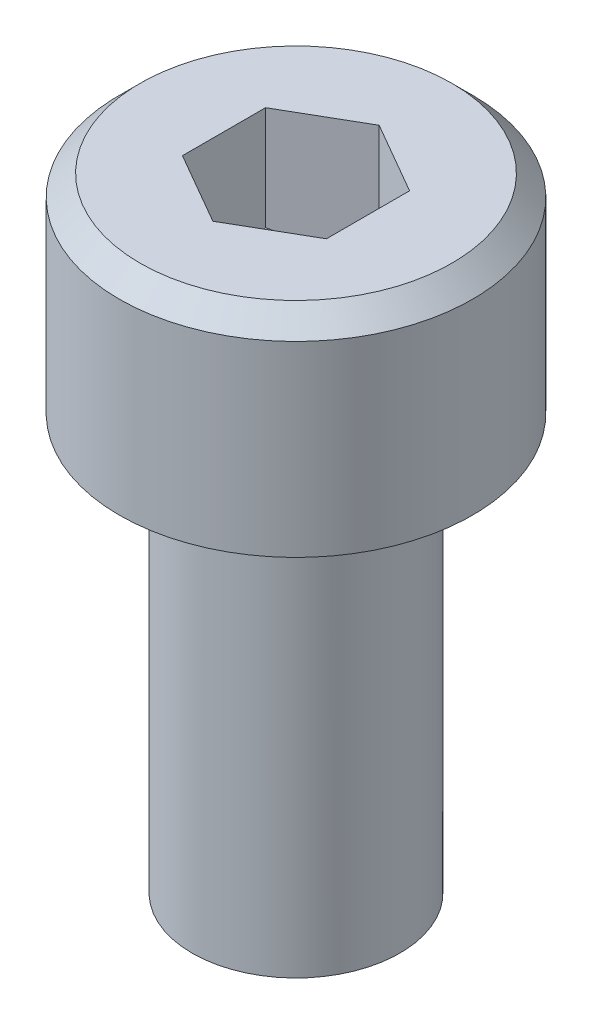
ISO-10303-21;
HEADER;
FILE_DESCRIPTION(('STEP AP214'),'2;1');
FILE_NAME('part.step','',(''),(''),'','','');
FILE_SCHEMA(('AUTOMOTIVE_DESIGN { 1 0 10303 214 1 1 1 1 }'));
ENDSEC;
DATA;
#1=APPLICATION_CONTEXT('core data for automotive mechanical design processes');
#2=APPLICATION_PROTOCOL_DEFINITION('international standard','automotive_design',2000,#1);
#3=PRODUCT_CONTEXT('',#1,'mechanical');
#4=PRODUCT('Part','Part','',(#3));
#5=PRODUCT_RELATED_PRODUCT_CATEGORY('part','',(#4));
#6=PRODUCT_DEFINITION_FORMATION('','',#4);
#7=PRODUCT_DEFINITION_CONTEXT('part definition',#1,'design');
#8=PRODUCT_DEFINITION('design','',#6,#7);
#9=PRODUCT_DEFINITION_SHAPE('','',#8);
#10=(LENGTH_UNIT() NAMED_UNIT(*) SI_UNIT(.MILLI.,.METRE.));
#11=(NAMED_UNIT(*) PLANE_ANGLE_UNIT() SI_UNIT($,.RADIAN.));
#12=(NAMED_UNIT(*) SI_UNIT($,.STERADIAN.) SOLID_ANGLE_UNIT());
#13=UNCERTAINTY_MEASURE_WITH_UNIT(LENGTH_MEASURE(1.E-05),#10,'distance_accuracy_value','');
#14=(GEOMETRIC_REPRESENTATION_CONTEXT(3) GLOBAL_UNCERTAINTY_ASSIGNED_CONTEXT((#13)) GLOBAL_UNIT_ASSIGNED_CONTEXT((#10,
#11,#12)) REPRESENTATION_CONTEXT('',''));
#15=CARTESIAN_POINT('',(0.,0.,0.));
#16=DIRECTION('',(0.,0.,1.));
#17=DIRECTION('',(1.,0.,0.));
#18=AXIS2_PLACEMENT_3D('',#15,#16,#17);
#19=CARTESIAN_POINT('',(0.,0.,0.));
#20=DIRECTION('',(0.,1.,0.));
#21=DIRECTION('',(0.,0.,1.));
#22=AXIS2_PLACEMENT_3D('',#19,#20,#21);
#23=PLANE('',#22);
#24=CARTESIAN_POINT('',(0.,0.,0.));
#25=DIRECTION('',(0.,1.,0.));
#26=DIRECTION('',(0.,0.,1.));
#27=AXIS2_PLACEMENT_3D('',#24,#25,#26);
#28=CIRCLE('',#27,4.25);
#29=CARTESIAN_POINT('',(0.,0.,4.25));
#30=VERTEX_POINT('',#29);
#31=EDGE_CURVE('E192',#30,#30,#28,.T.);
#32=ORIENTED_EDGE('',*,*,#31,.F.);
#33=EDGE_LOOP('',(#32));
#34=FACE_BOUND('',#33,.T.);
#35=CARTESIAN_POINT('',(0.,0.,0.));
#36=DIRECTION('',(0.,1.,0.));
#37=DIRECTION('',(0.,0.,1.));
#38=AXIS2_PLACEMENT_3D('',#35,#36,#37);
#39=CIRCLE('',#38,2.5);
#40=CARTESIAN_POINT('',(0.,0.,2.5));
#41=VERTEX_POINT('',#40);
#42=EDGE_CURVE('E11',#41,#41,#39,.F.);
#43=ORIENTED_EDGE('',*,*,#42,.F.);
#44=EDGE_LOOP('',(#43));
#45=FACE_BOUND('',#44,.T.);
#46=ADVANCED_FACE('F32',(#34,#45),#23,.F.);
#47=CARTESIAN_POINT('',(0.,5.,0.));
#48=DIRECTION('',(0.,1.,0.));
#49=DIRECTION('',(0.,0.,1.));
#50=AXIS2_PLACEMENT_3D('',#47,#48,#49);
#51=PLANE('',#50);
#52=CARTESIAN_POINT('',(0.,5.,0.));
#53=DIRECTION('',(0.,1.,0.));
#54=DIRECTION('',(0.,0.,1.));
#55=AXIS2_PLACEMENT_3D('',#52,#53,#54);
#56=CIRCLE('',#55,3.75);
#57=CARTESIAN_POINT('',(0.,5.,3.75));
#58=VERTEX_POINT('',#57);
#59=EDGE_CURVE('E105',#58,#58,#56,.T.);
#60=ORIENTED_EDGE('',*,*,#59,.T.);
#61=EDGE_LOOP('',(#60));
#62=FACE_BOUND('',#61,.T.);
#63=DIRECTION('',(-0.866025403784439,0.,0.5));
#64=VECTOR('',#63,1.);
#65=CARTESIAN_POINT('',(0.,5.,-2.));
#66=LINE('',#65,#64);
#67=CARTESIAN_POINT('',(0.,5.,-2.));
#68=VERTEX_POINT('',#67);
#69=CARTESIAN_POINT('',(-1.73205080756888,5.,-1.));
#70=VERTEX_POINT('',#69);
#71=EDGE_CURVE('E168',#68,#70,#66,.T.);
#72=ORIENTED_EDGE('',*,*,#71,.F.);
#73=DIRECTION('',(-0.866025403784439,0.,-0.5));
#74=VECTOR('',#73,1.);
#75=CARTESIAN_POINT('',(1.73205080756888,5.,-1.));
#76=LINE('',#75,#74);
#77=CARTESIAN_POINT('',(1.73205080756888,5.,-1.));
#78=VERTEX_POINT('',#77);
#79=EDGE_CURVE('E166',#78,#68,#76,.T.);
#80=ORIENTED_EDGE('',*,*,#79,.F.);
#81=DIRECTION('',(0.,0.,-1.));
#82=VECTOR('',#81,1.);
#83=CARTESIAN_POINT('',(1.73205080756888,5.,1.));
#84=LINE('',#83,#82);
#85=CARTESIAN_POINT('',(1.73205080756888,5.,1.));
#86=VERTEX_POINT('',#85);
#87=EDGE_CURVE('E177',#86,#78,#84,.T.);
#88=ORIENTED_EDGE('',*,*,#87,.F.);
#89=DIRECTION('',(0.866025403784439,0.,-0.5));
#90=VECTOR('',#89,1.);
#91=CARTESIAN_POINT('',(0.,5.,2.));
#92=LINE('',#91,#90);
#93=CARTESIAN_POINT('',(0.,5.,2.));
#94=VERTEX_POINT('',#93);
#95=EDGE_CURVE('E174',#94,#86,#92,.T.);
#96=ORIENTED_EDGE('',*,*,#95,.F.);
#97=DIRECTION('',(0.866025403784439,0.,0.5));
#98=VECTOR('',#97,1.);
#99=CARTESIAN_POINT('',(-1.73205080756888,5.,1.));
#100=LINE('',#99,#98);
#101=CARTESIAN_POINT('',(-1.73205080756888,5.,1.));
#102=VERTEX_POINT('',#101);
#103=EDGE_CURVE('E172',#102,#94,#100,.T.);
#104=ORIENTED_EDGE('',*,*,#103,.F.);
#105=DIRECTION('',(0.,0.,1.));
#106=VECTOR('',#105,1.);
#107=CARTESIAN_POINT('',(-1.73205080756888,5.,-1.));
#108=LINE('',#107,#106);
#109=EDGE_CURVE('E170',#70,#102,#108,.T.);
#110=ORIENTED_EDGE('',*,*,#109,.F.);
#111=EDGE_LOOP('',(#72,#80,#88,#96,#104,#110));
#112=FACE_BOUND('',#111,.T.);
#113=ADVANCED_FACE('F160',(#62,#112),#51,.T.);
#114=CARTESIAN_POINT('',(0.,5.,0.));
#115=DIRECTION('',(0.,-1.,0.));
#116=DIRECTION('',(0.,0.,-1.));
#117=AXIS2_PLACEMENT_3D('',#114,#115,#116);
#118=CYLINDRICAL_SURFACE('',#117,4.25);
#119=CARTESIAN_POINT('',(0.,4.5,0.));
#120=DIRECTION('',(0.,1.,0.));
#121=DIRECTION('',(0.,0.,1.));
#122=AXIS2_PLACEMENT_3D('',#119,#120,#121);
#123=CIRCLE('',#122,4.25);
#124=CARTESIAN_POINT('',(0.,4.5,4.25));
#125=VERTEX_POINT('',#124);
#126=EDGE_CURVE('E103',#125,#125,#123,.F.);
#127=ORIENTED_EDGE('',*,*,#126,.T.);
#128=EDGE_LOOP('',(#127));
#129=FACE_BOUND('',#128,.T.);
#130=ORIENTED_EDGE('',*,*,#31,.T.);
#131=EDGE_LOOP('',(#130));
#132=FACE_BOUND('',#131,.T.);
#133=ADVANCED_FACE('F158',(#129,#132),#118,.T.);
#134=CARTESIAN_POINT('',(1.73205080756888,5.,-1.));
#135=DIRECTION('',(-0.5,0.,0.866025403784439));
#136=DIRECTION('',(0.866025403784439,0.,0.5));
#137=AXIS2_PLACEMENT_3D('',#134,#135,#136);
#138=PLANE('',#137);
#139=CARTESIAN_POINT('',(1.73225080756888,2.50006667243984,-0.999884529946163));
#140=CARTESIAN_POINT('',(1.65613428887404,2.4746827944393,-1.04383042250441));
#141=CARTESIAN_POINT('',(1.57936074093407,2.4515966496139,-1.08815565107419));
#142=CARTESIAN_POINT('',(1.42448408732132,2.41129855775073,-1.1775737287287));
#143=CARTESIAN_POINT('',(1.34637822864777,2.39410086841456,-1.22266816725916));
#144=CARTESIAN_POINT('',(1.19113453943101,2.36732879891765,-1.31229815301844));
#145=CARTESIAN_POINT('',(1.11402060217238,2.35757625955007,-1.35681990545299));
#146=CARTESIAN_POINT('',(0.959429673697303,2.34593140028623,-1.44607301962235));
#147=CARTESIAN_POINT('',(0.881953244796008,2.34402943993446,-1.49080405670436));
#148=CARTESIAN_POINT('',(0.737170488028564,2.34797525273925,-1.57439442029806));
#149=CARTESIAN_POINT('',(0.669842543569503,2.3528541917126,-1.61326622715548));
#150=CARTESIAN_POINT('',(0.535625319068816,2.36832095959228,-1.69075657785084));
#151=CARTESIAN_POINT('',(0.468736503645497,2.37891407765609,-1.72937485344127));
#152=CARTESIAN_POINT('',(0.334242298486415,2.40539738895299,-1.80702511899431));
#153=CARTESIAN_POINT('',(0.266653940840587,2.42139990201939,-1.84604727547521));
#154=CARTESIAN_POINT('',(0.132485590661142,2.45771982631927,-1.92350940856804));
#155=CARTESIAN_POINT('',(0.0659038777399556,2.47802869743662,-1.9619503784462));
#156=CARTESIAN_POINT('',(-0.000200000000000149,2.50006667243984,-2.00011547005384));
#157=B_SPLINE_CURVE_WITH_KNOTS('',3,(#139,#140,#141,#142,#143,#144,#145,#146,#147,#148,#149,
#150,#151,#152,#153,#154,#155,#156),.UNSPECIFIED.,.F.,.F.,(4,2,2,2,2,2,2,2,4),(0.,
0.27455973272559,0.54977963137929,0.818187148094555,1.08626496403989,1.31973233850631,
1.55341618675482,1.79228517679322,2.03068481371441),.UNSPECIFIED.);
#158=CARTESIAN_POINT('',(1.73205080756888,2.5,-1.));
#159=VERTEX_POINT('',#158);
#160=CARTESIAN_POINT('',(0.,2.5,-2.));
#161=VERTEX_POINT('',#160);
#162=EDGE_CURVE('E98',#159,#161,#157,.T.);
#163=ORIENTED_EDGE('',*,*,#162,.F.);
#164=DIRECTION('',(0.,-1.,0.));
#165=VECTOR('',#164,1.);
#166=CARTESIAN_POINT('',(1.73205080756888,5.,-1.));
#167=LINE('',#166,#165);
#168=EDGE_CURVE('E179',#78,#159,#167,.T.);
#169=ORIENTED_EDGE('',*,*,#168,.F.);
#170=ORIENTED_EDGE('',*,*,#79,.T.);
#171=DIRECTION('',(0.,-1.,0.));
#172=VECTOR('',#171,1.);
#173=CARTESIAN_POINT('',(0.,5.,-2.));
#174=LINE('',#173,#172);
#175=EDGE_CURVE('E190',#68,#161,#174,.T.);
#176=ORIENTED_EDGE('',*,*,#175,.T.);
#177=EDGE_LOOP('',(#163,#169,#170,#176));
#178=FACE_BOUND('',#177,.T.);
#179=ADVANCED_FACE('F154',(#178),#138,.T.);
#180=CARTESIAN_POINT('',(0.,5.,-2.));
#181=DIRECTION('',(0.5,0.,0.866025403784439));
#182=DIRECTION('',(0.866025403784439,0.,-0.5));
#183=AXIS2_PLACEMENT_3D('',#180,#181,#182);
#184=PLANE('',#183);
#185=CARTESIAN_POINT('',(0.000199999999999798,2.50006667243984,-2.00011547005384));
#186=CARTESIAN_POINT('',(-0.0759165186948397,2.4746827944393,-1.9561695774956));
#187=CARTESIAN_POINT('',(-0.152690066634804,2.4515966496139,-1.91184434892581));
#188=CARTESIAN_POINT('',(-0.307566720247552,2.41129855775073,-1.82242627127131));
#189=CARTESIAN_POINT('',(-0.385672578921111,2.39410086841456,-1.77733183274084));
#190=CARTESIAN_POINT('',(-0.540916268137865,2.36732879891765,-1.68770184698156));
#191=CARTESIAN_POINT('',(-0.618030205396501,2.35757625955007,-1.64318009454701));
#192=CARTESIAN_POINT('',(-0.772621133871575,2.34593140028623,-1.55392698037765));
#193=CARTESIAN_POINT('',(-0.850097562772869,2.34402943993446,-1.50919594329564));
#194=CARTESIAN_POINT('',(-0.994880319540313,2.34797525273925,-1.42560557970194));
#195=CARTESIAN_POINT('',(-1.06220826399937,2.3528541917126,-1.38673377284452));
#196=CARTESIAN_POINT('',(-1.19642548850006,2.36832095959228,-1.30924342214916));
#197=CARTESIAN_POINT('',(-1.26331430392338,2.37891407765609,-1.27062514655873));
#198=CARTESIAN_POINT('',(-1.39780850908246,2.40539738895299,-1.19297488100569));
#199=CARTESIAN_POINT('',(-1.46539686672829,2.42139990201939,-1.15395272452479));
#200=CARTESIAN_POINT('',(-1.59956521690774,2.45771982631927,-1.07649059143196));
#201=CARTESIAN_POINT('',(-1.66614692982892,2.47802869743662,-1.0380496215538));
#202=CARTESIAN_POINT('',(-1.73225080756888,2.50006667243984,-0.999884529946163));
#203=B_SPLINE_CURVE_WITH_KNOTS('',3,(#185,#186,#187,#188,#189,#190,#191,#192,#193,#194,#195,
#196,#197,#198,#199,#200,#201,#202),.UNSPECIFIED.,.F.,.F.,(4,2,2,2,2,2,2,2,4),(0.,
0.274559732725589,0.54977963137929,0.818187148094556,1.08626496403989,1.31973233850631,
1.55341618675482,1.79228517679322,2.03068481371441),.UNSPECIFIED.);
#204=CARTESIAN_POINT('',(-1.73205080756888,2.5,-1.));
#205=VERTEX_POINT('',#204);
#206=EDGE_CURVE('E47',#161,#205,#203,.T.);
#207=ORIENTED_EDGE('',*,*,#206,.F.);
#208=ORIENTED_EDGE('',*,*,#175,.F.);
#209=ORIENTED_EDGE('',*,*,#71,.T.);
#210=DIRECTION('',(0.,-1.,0.));
#211=VECTOR('',#210,1.);
#212=CARTESIAN_POINT('',(-1.73205080756888,5.,-1.));
#213=LINE('',#212,#211);
#214=EDGE_CURVE('E188',#70,#205,#213,.T.);
#215=ORIENTED_EDGE('',*,*,#214,.T.);
#216=EDGE_LOOP('',(#207,#208,#209,#215));
#217=FACE_BOUND('',#216,.T.);
#218=ADVANCED_FACE('F150',(#217),#184,.T.);
#219=CARTESIAN_POINT('',(-1.73205080756888,5.,-1.));
#220=DIRECTION('',(1.,0.,0.));
#221=DIRECTION('',(0.,0.,-1.));
#222=AXIS2_PLACEMENT_3D('',#219,#220,#221);
#223=PLANE('',#222);
#224=CARTESIAN_POINT('',(-1.73205080756888,3.1440376125908,-2.5896673159434));
#225=CARTESIAN_POINT('',(-1.73205080756888,3.1081532993572,-2.51487129441258));
#226=CARTESIAN_POINT('',(-1.73205080756888,3.07264180094342,-2.43989321341111));
#227=CARTESIAN_POINT('',(-1.73205080756888,3.00257568839842,-2.28947551049629));
#228=CARTESIAN_POINT('',(-1.73205080756888,2.96802124647377,-2.21403580846524));
#229=CARTESIAN_POINT('',(-1.73205080756888,2.89988746183312,-2.06216489115277));
#230=CARTESIAN_POINT('',(-1.73205080756888,2.86631530559594,-1.98573043725538));
#231=CARTESIAN_POINT('',(-1.73205080756888,2.80067719106254,-1.83222138430322));
#232=CARTESIAN_POINT('',(-1.73205080756888,2.76861115445054,-1.75514681877901));
#233=CARTESIAN_POINT('',(-1.73205080756888,2.70556618325513,-1.59819907537578));
#234=CARTESIAN_POINT('',(-1.73205080756888,2.67463757869329,-1.51830540788734));
#235=CARTESIAN_POINT('',(-1.73205080756888,2.61536217373233,-1.35756906964271));
#236=CARTESIAN_POINT('',(-1.73205080756888,2.58701569685053,-1.27672628139876));
#237=CARTESIAN_POINT('',(-1.73205080756888,2.50704492676769,-1.03290576350719));
#238=CARTESIAN_POINT('',(-1.73205080756888,2.46030169353859,-0.868189689498154));
#239=CARTESIAN_POINT('',(-1.73205080756888,2.40608184073772,-0.617819867786136));
#240=CARTESIAN_POINT('',(-1.73205080756888,2.39066472317627,-0.533893853699956));
#241=CARTESIAN_POINT('',(-1.73205080756888,2.36618570680831,-0.365097731528907));
#242=CARTESIAN_POINT('',(-1.73205080756888,2.3571233785332,-0.280227687637224));
#243=CARTESIAN_POINT('',(-1.73205080756888,2.34619219923897,-0.111034775162018));
#244=CARTESIAN_POINT('',(-1.73205080756888,2.34423846009099,-0.0267175343234751));
#245=CARTESIAN_POINT('',(-1.73205080756888,2.34746339548105,0.141777688116827));
#246=CARTESIAN_POINT('',(-1.73205080756888,2.35264251165942,0.225955660772505));
#247=CARTESIAN_POINT('',(-1.73205080756888,2.37376540485988,0.433652313400891));
#248=CARTESIAN_POINT('',(-1.73205080756888,2.39366766704096,0.556768504070765));
#249=CARTESIAN_POINT('',(-1.73205080756888,2.44498985869219,0.800606744349552));
#250=CARTESIAN_POINT('',(-1.73205080756888,2.47642366971486,0.92132572282165));
#251=CARTESIAN_POINT('',(-1.73205080756888,2.53012030029334,1.10187422867007));
#252=CARTESIAN_POINT('',(-1.73205080756888,2.54936060168207,1.16263703303128));
#253=CARTESIAN_POINT('',(-1.73205080756888,2.58962104251422,1.28353014044251));
#254=CARTESIAN_POINT('',(-1.73205080756888,2.61064007120124,1.34366081224314));
#255=CARTESIAN_POINT('',(-1.73205080756888,2.65415270851257,1.46337001063291));
#256=CARTESIAN_POINT('',(-1.73205080756888,2.67664604915465,1.52294863533161));
#257=CARTESIAN_POINT('',(-1.73205080756888,2.72286400880403,1.64163642546934));
#258=CARTESIAN_POINT('',(-1.73205080756888,2.74658883584065,1.70074550963375));
#259=CARTESIAN_POINT('',(-1.73205080756888,2.80866719587004,1.85162387606727));
#260=CARTESIAN_POINT('',(-1.73205080756888,2.84775318254703,1.94309147041311));
#261=CARTESIAN_POINT('',(-1.73205080756888,2.92780932652803,2.12520067435816));
#262=CARTESIAN_POINT('',(-1.73205080756888,2.96877962498281,2.21584222146815));
#263=CARTESIAN_POINT('',(-1.73205080756888,3.09385274691322,2.48680302855764));
#264=CARTESIAN_POINT('',(-1.73205080756888,3.18010497450379,2.66612818791705));
#265=CARTESIAN_POINT('',(-1.73205080756888,3.35622683330508,3.02324647302675));
#266=CARTESIAN_POINT('',(-1.73205080756888,3.44610078118306,3.20103744437731));
#267=CARTESIAN_POINT('',(-1.73205080756888,3.62815962598208,3.5554012639214));
#268=CARTESIAN_POINT('',(-1.73205080756888,3.72034422915963,3.73197426334749));
#269=CARTESIAN_POINT('',(-1.73205080756888,3.89752920335285,4.06765088834573));
#270=CARTESIAN_POINT('',(-1.73205080756888,3.98238641949491,4.22683034049175));
#271=CARTESIAN_POINT('',(-1.73205080756888,4.15306771260156,4.54467721159046));
#272=CARTESIAN_POINT('',(-1.73205080756888,4.23889182534709,4.70334461131279));
#273=CARTESIAN_POINT('',(-1.73205080756888,4.41104522302679,5.01988184110242));
#274=CARTESIAN_POINT('',(-1.73205080756888,4.49737266780107,5.17775267330624));
#275=CARTESIAN_POINT('',(-1.73205080756888,4.67058942356533,5.49317516088085));
#276=CARTESIAN_POINT('',(-1.73205080756888,4.75747870491512,5.65072683252255));
#277=CARTESIAN_POINT('',(-1.73205080756888,4.8445740129932,5.80816383701844));
#278=B_SPLINE_CURVE_WITH_KNOTS('',3,(#224,#225,#226,#227,#228,#229,#230,#231,#232,#233,#234,
#235,#236,#237,#238,#239,#240,#241,#242,#243,#244,#245,#246,#247,#248,#249,#250,#251,#252,#253,
#254,#255,#256,#257,#258,#259,#260,#261,#262,#263,#264,#265,#266,#267,#268,#269,#270,#271,#272,
#273,#274,#275,#276,#277),.UNSPECIFIED.,.F.,.F.,(4,2,2,2,2,2,2,2,2,2,2,2,2,2,2,2,2,2,2,2,2,2,2,
2,2,2,4),(0.,0.248878971051947,0.497802436625335,0.748235880772791,0.998656288339561,
1.25562290868844,1.51262168048206,2.02516943334833,2.28096617636514,2.53674563049094,
2.78946044710838,3.04219091160701,3.41556675213835,3.78939354126393,3.98058119009729,
4.17165031733908,4.36268481019155,4.55375167931396,4.85212720532223,5.15052511868171,
5.74741950373562,6.34504767480783,6.94260025353071,7.48375227728851,8.02492439311034,
8.56472002352741,9.10448740518546),.UNSPECIFIED.);
#279=CARTESIAN_POINT('',(-1.73205080756888,2.5,1.));
#280=VERTEX_POINT('',#279);
#281=EDGE_CURVE('E55',#205,#280,#278,.T.);
#282=ORIENTED_EDGE('',*,*,#281,.F.);
#283=ORIENTED_EDGE('',*,*,#214,.F.);
#284=ORIENTED_EDGE('',*,*,#109,.T.);
#285=DIRECTION('',(0.,-1.,0.));
#286=VECTOR('',#285,1.);
#287=CARTESIAN_POINT('',(-1.73205080756888,5.,1.));
#288=LINE('',#287,#286);
#289=EDGE_CURVE('E186',#102,#280,#288,.T.);
#290=ORIENTED_EDGE('',*,*,#289,.T.);
#291=EDGE_LOOP('',(#282,#283,#284,#290));
#292=FACE_BOUND('',#291,.T.);
#293=ADVANCED_FACE('F147',(#292),#223,.T.);
#294=CARTESIAN_POINT('',(-1.73205080756888,5.,1.));
#295=DIRECTION('',(0.5,0.,-0.866025403784439));
#296=DIRECTION('',(-0.866025403784439,0.,-0.5));
#297=AXIS2_PLACEMENT_3D('',#294,#295,#296);
#298=PLANE('',#297);
#299=CARTESIAN_POINT('',(-1.73225080756888,2.50006667243984,0.999884529946162));
#300=CARTESIAN_POINT('',(-1.65613428887404,2.4746827944393,1.04383042250441));
#301=CARTESIAN_POINT('',(-1.57936074093407,2.4515966496139,1.08815565107419));
#302=CARTESIAN_POINT('',(-1.42448408732133,2.41129855775073,1.17757372872869));
#303=CARTESIAN_POINT('',(-1.34637822864777,2.39410086841456,1.22266816725916));
#304=CARTESIAN_POINT('',(-1.19113453943101,2.36732879891765,1.31229815301844));
#305=CARTESIAN_POINT('',(-1.11402060217238,2.35757625955007,1.35681990545299));
#306=CARTESIAN_POINT('',(-0.959429673697303,2.34593140028623,1.44607301962235));
#307=CARTESIAN_POINT('',(-0.881953244796009,2.34402943993446,1.49080405670436));
#308=CARTESIAN_POINT('',(-0.737170488028564,2.34797525273925,1.57439442029806));
#309=CARTESIAN_POINT('',(-0.669842543569504,2.3528541917126,1.61326622715548));
#310=CARTESIAN_POINT('',(-0.535625319068816,2.36832095959228,1.69075657785084));
#311=CARTESIAN_POINT('',(-0.468736503645497,2.37891407765609,1.72937485344127));
#312=CARTESIAN_POINT('',(-0.334242298486415,2.40539738895299,1.80702511899431));
#313=CARTESIAN_POINT('',(-0.266653940840588,2.42139990201939,1.84604727547521));
#314=CARTESIAN_POINT('',(-0.132485590661142,2.45771982631927,1.92350940856804));
#315=CARTESIAN_POINT('',(-0.065903877739956,2.47802869743662,1.9619503784462));
#316=CARTESIAN_POINT('',(0.000199999999999636,2.50006667243984,2.00011547005384));
#317=B_SPLINE_CURVE_WITH_KNOTS('',3,(#299,#300,#301,#302,#303,#304,#305,#306,#307,#308,#309,
#310,#311,#312,#313,#314,#315,#316),.UNSPECIFIED.,.F.,.F.,(4,2,2,2,2,2,2,2,4),(0.,
0.274559732725589,0.54977963137929,0.818187148094555,1.08626496403989,1.31973233850631,
1.55341618675482,1.79228517679322,2.03068481371441),.UNSPECIFIED.);
#318=CARTESIAN_POINT('',(0.,2.5,2.));
#319=VERTEX_POINT('',#318);
#320=EDGE_CURVE('E132',#280,#319,#317,.T.);
#321=ORIENTED_EDGE('',*,*,#320,.F.);
#322=ORIENTED_EDGE('',*,*,#289,.F.);
#323=ORIENTED_EDGE('',*,*,#103,.T.);
#324=DIRECTION('',(0.,-1.,0.));
#325=VECTOR('',#324,1.);
#326=CARTESIAN_POINT('',(0.,5.,2.));
#327=LINE('',#326,#325);
#328=EDGE_CURVE('E183',#94,#319,#327,.T.);
#329=ORIENTED_EDGE('',*,*,#328,.T.);
#330=EDGE_LOOP('',(#321,#322,#323,#329));
#331=FACE_BOUND('',#330,.T.);
#332=ADVANCED_FACE('F122',(#331),#298,.T.);
#333=CARTESIAN_POINT('',(0.,5.,2.));
#334=DIRECTION('',(-0.5,0.,-0.866025403784439));
#335=DIRECTION('',(-0.866025403784439,0.,0.5));
#336=AXIS2_PLACEMENT_3D('',#333,#334,#335);
#337=PLANE('',#336);
#338=CARTESIAN_POINT('',(-0.000200000000000151,2.50006667243984,2.00011547005384));
#339=CARTESIAN_POINT('',(0.0759165186948392,2.4746827944393,1.9561695774956));
#340=CARTESIAN_POINT('',(0.152690066634804,2.4515966496139,1.91184434892581));
#341=CARTESIAN_POINT('',(0.307566720247552,2.41129855775073,1.82242627127131));
#342=CARTESIAN_POINT('',(0.385672578921111,2.39410086841456,1.77733183274084));
#343=CARTESIAN_POINT('',(0.540916268137864,2.36732879891765,1.68770184698156));
#344=CARTESIAN_POINT('',(0.6180302053965,2.35757625955007,1.64318009454701));
#345=CARTESIAN_POINT('',(0.772621133871574,2.34593140028623,1.55392698037765));
#346=CARTESIAN_POINT('',(0.850097562772869,2.34402943993446,1.50919594329564));
#347=CARTESIAN_POINT('',(0.994880319540313,2.34797525273925,1.42560557970194));
#348=CARTESIAN_POINT('',(1.06220826399937,2.3528541917126,1.38673377284452));
#349=CARTESIAN_POINT('',(1.19642548850006,2.36832095959228,1.30924342214916));
#350=CARTESIAN_POINT('',(1.26331430392338,2.37891407765609,1.27062514655873));
#351=CARTESIAN_POINT('',(1.39780850908246,2.40539738895299,1.19297488100569));
#352=CARTESIAN_POINT('',(1.46539686672829,2.42139990201939,1.15395272452479));
#353=CARTESIAN_POINT('',(1.59956521690774,2.45771982631927,1.07649059143196));
#354=CARTESIAN_POINT('',(1.66614692982892,2.47802869743662,1.0380496215538));
#355=CARTESIAN_POINT('',(1.73225080756888,2.50006667243984,0.999884529946163));
#356=B_SPLINE_CURVE_WITH_KNOTS('',3,(#338,#339,#340,#341,#342,#343,#344,#345,#346,#347,#348,
#349,#350,#351,#352,#353,#354,#355),.UNSPECIFIED.,.F.,.F.,(4,2,2,2,2,2,2,2,4),(0.,
0.274559732725589,0.54977963137929,0.818187148094555,1.08626496403989,1.31973233850631,
1.55341618675482,1.79228517679322,2.03068481371441),.UNSPECIFIED.);
#357=CARTESIAN_POINT('',(1.73205080756888,2.5,1.));
#358=VERTEX_POINT('',#357);
#359=EDGE_CURVE('E100',#319,#358,#356,.T.);
#360=ORIENTED_EDGE('',*,*,#359,.F.);
#361=ORIENTED_EDGE('',*,*,#328,.F.);
#362=ORIENTED_EDGE('',*,*,#95,.T.);
#363=DIRECTION('',(0.,-1.,0.));
#364=VECTOR('',#363,1.);
#365=CARTESIAN_POINT('',(1.73205080756888,5.,1.));
#366=LINE('',#365,#364);
#367=EDGE_CURVE('E181',#86,#358,#366,.T.);
#368=ORIENTED_EDGE('',*,*,#367,.T.);
#369=EDGE_LOOP('',(#360,#361,#362,#368));
#370=FACE_BOUND('',#369,.T.);
#371=ADVANCED_FACE('F118',(#370),#337,.T.);
#372=CARTESIAN_POINT('',(1.73205080756888,5.,1.));
#373=DIRECTION('',(-1.,0.,0.));
#374=DIRECTION('',(0.,0.,1.));
#375=AXIS2_PLACEMENT_3D('',#372,#373,#374);
#376=PLANE('',#375);
#377=CARTESIAN_POINT('',(1.73205080756888,3.1440376121438,-2.58966731501197));
#378=CARTESIAN_POINT('',(1.73205080756888,3.10815329892946,-2.51487129351298));
#379=CARTESIAN_POINT('',(1.73205080756888,3.07264180053492,-2.43989321254337));
#380=CARTESIAN_POINT('',(1.73205080756888,3.0025756880283,-2.28947550969238));
#381=CARTESIAN_POINT('',(1.73205080756888,2.96802124612279,-2.2140358076933));
#382=CARTESIAN_POINT('',(1.73205080756888,2.89988746152044,-2.06216489044537));
#383=CARTESIAN_POINT('',(1.73205080756888,2.86631530530242,-1.98573043658058));
#384=CARTESIAN_POINT('',(1.73205080756888,2.80067719080696,-1.83222138369384));
#385=CARTESIAN_POINT('',(1.73205080756888,2.76861115421374,-1.75514681820246));
#386=CARTESIAN_POINT('',(1.73205080756888,2.70556618305602,-1.59819907486682));
#387=CARTESIAN_POINT('',(1.73205080756888,2.67463757851306,-1.51830540741315));
#388=CARTESIAN_POINT('',(1.73205080756888,2.61536217358868,-1.35756906923866));
#389=CARTESIAN_POINT('',(1.73205080756888,2.58701569672458,-1.27672628103008));
#390=CARTESIAN_POINT('',(1.73205080756888,2.50704492669197,-1.03290576324555));
#391=CARTESIAN_POINT('',(1.73205080756888,2.46030169349274,-0.868189689309527));
#392=CARTESIAN_POINT('',(1.73205080756888,2.40608184072605,-0.617819867720793));
#393=CARTESIAN_POINT('',(1.73205080756888,2.39066472317469,-0.533893853683333));
#394=CARTESIAN_POINT('',(1.73205080756888,2.36618570681934,-0.365097731610749));
#395=CARTESIAN_POINT('',(1.73205080756888,2.35712337854676,-0.280227687768812));
#396=CARTESIAN_POINT('',(1.73205080756888,2.34619219924885,-0.111034775392171));
#397=CARTESIAN_POINT('',(1.73205080756888,2.34423846009481,-0.0267175346024432));
#398=CARTESIAN_POINT('',(1.73205080756888,2.34746339546468,0.141777687741147));
#399=CARTESIAN_POINT('',(1.73205080756888,2.3526425116289,0.225955660348927));
#400=CARTESIAN_POINT('',(1.73205080756888,2.37376540479039,0.433652312899458));
#401=CARTESIAN_POINT('',(1.73205080756888,2.39366766694749,0.556768503539924));
#402=CARTESIAN_POINT('',(1.73205080756888,2.44498985855003,0.800606743761767));
#403=CARTESIAN_POINT('',(1.73205080756888,2.47642366954801,0.921325722206333));
#404=CARTESIAN_POINT('',(1.73205080756888,2.53012030008984,1.10187422801349));
#405=CARTESIAN_POINT('',(1.73205080756888,2.54936060146625,1.16263703236067));
#406=CARTESIAN_POINT('',(1.73205080756888,2.58962104227408,1.283530139744));
#407=CARTESIAN_POINT('',(1.73205080756888,2.61064007094909,1.34366081153074));
#408=CARTESIAN_POINT('',(1.73205080756888,2.65415270823676,1.46337000989281));
#409=CARTESIAN_POINT('',(1.73205080756888,2.67664604886718,1.5229486345777));
#410=CARTESIAN_POINT('',(1.73205080756888,2.72286400849357,1.64163642468778));
#411=CARTESIAN_POINT('',(1.73205080756888,2.74658883551887,1.70074550883838));
#412=CARTESIAN_POINT('',(1.73205080756888,2.80866719553044,1.85162387526272));
#413=CARTESIAN_POINT('',(1.73205080756888,2.84775318220185,1.9430914696129));
#414=CARTESIAN_POINT('',(1.73205080756888,2.92780932617327,2.12520067356608));
#415=CARTESIAN_POINT('',(1.73205080756888,2.96877962462403,2.21584222067988));
#416=CARTESIAN_POINT('',(1.73205080756888,3.09385274654407,2.48680302778019));
#417=CARTESIAN_POINT('',(1.73205080756888,3.18010497412995,2.66612818714598));
#418=CARTESIAN_POINT('',(1.73205080756888,3.35622683292435,3.02324647226766));
#419=CARTESIAN_POINT('',(1.73205080756888,3.44610078080014,3.20103744362382));
#420=CARTESIAN_POINT('',(1.73205080756888,3.62815962559616,3.55540126317838));
#421=CARTESIAN_POINT('',(1.73205080756888,3.72034422877288,3.73197426260937));
#422=CARTESIAN_POINT('',(1.73205080756888,3.89752920296299,4.06765088761205));
#423=CARTESIAN_POINT('',(1.73205080756888,3.98238641910266,4.22683033975769));
#424=CARTESIAN_POINT('',(1.73205080756888,4.15306771220493,4.54467721085543));
#425=CARTESIAN_POINT('',(1.73205080756888,4.23889182494848,4.70334461057717));
#426=CARTESIAN_POINT('',(1.73205080756888,4.41104522262423,5.01988184036493));
#427=CARTESIAN_POINT('',(1.73205080756888,4.49737266739653,5.17775267256748));
#428=CARTESIAN_POINT('',(1.73205080756888,4.67058942315703,5.4931751601394));
#429=CARTESIAN_POINT('',(1.73205080756888,4.75747870450504,5.65072683177969));
#430=CARTESIAN_POINT('',(1.73205080756888,4.8445740125814,5.80816383627415));
#431=B_SPLINE_CURVE_WITH_KNOTS('',3,(#377,#378,#379,#380,#381,#382,#383,#384,#385,#386,#387,
#388,#389,#390,#391,#392,#393,#394,#395,#396,#397,#398,#399,#400,#401,#402,#403,#404,#405,#406,
#407,#408,#409,#410,#411,#412,#413,#414,#415,#416,#417,#418,#419,#420,#421,#422,#423,#424,#425,
#426,#427,#428,#429,#430),.UNSPECIFIED.,.F.,.F.,(4,2,2,2,2,2,2,2,2,2,2,2,2,2,2,2,2,2,2,2,2,2,2,
2,2,2,4),(0.,0.24887897094086,0.49780243640314,0.748235880437985,0.998656287892153,
1.25562290812334,1.51262167979923,2.02516943243142,2.28096617529934,2.53674562927646,
2.78946044574846,3.04219091010152,3.41556675053439,3.78939353956123,3.98058118834331,
4.17165031553388,4.36268480833522,4.55375167740647,4.85212720342009,5.15052511678497,
5.74741950184992,6.34504767293412,6.94260025166884,7.48375227542224,8.0249243912397,
8.56472002165055,9.10448740330234),.UNSPECIFIED.);
#432=EDGE_CURVE('E40',#358,#159,#431,.F.);
#433=ORIENTED_EDGE('',*,*,#432,.F.);
#434=ORIENTED_EDGE('',*,*,#367,.F.);
#435=ORIENTED_EDGE('',*,*,#87,.T.);
#436=ORIENTED_EDGE('',*,*,#168,.T.);
#437=EDGE_LOOP('',(#433,#434,#435,#436));
#438=FACE_BOUND('',#437,.T.);
#439=ADVANCED_FACE('F114',(#438),#376,.T.);
#440=CARTESIAN_POINT('',(0.,5.,0.));
#441=DIRECTION('',(0.,-1.,0.));
#442=DIRECTION('',(0.,0.,-1.));
#443=AXIS2_PLACEMENT_3D('',#440,#441,#442);
#444=CONICAL_SURFACE('',#443,3.75,0.785398163397447);
#445=ORIENTED_EDGE('',*,*,#126,.F.);
#446=EDGE_LOOP('',(#445));
#447=FACE_BOUND('',#446,.T.);
#448=ORIENTED_EDGE('',*,*,#59,.F.);
#449=EDGE_LOOP('',(#448));
#450=FACE_BOUND('',#449,.T.);
#451=ADVANCED_FACE('F34',(#447,#450),#444,.T.);
#452=CARTESIAN_POINT('',(0.,2.5,0.));
#453=DIRECTION('',(0.,1.,0.));
#454=DIRECTION('',(-1.,0.,0.));
#455=AXIS2_PLACEMENT_3D('',#452,#453,#454);
#456=CONICAL_SURFACE('',#455,2.,1.0471975511966);
#457=CARTESIAN_POINT('',(0.,1.34529946162075,0.));
#458=VERTEX_POINT('',#457);
#459=VERTEX_LOOP('',#458);
#460=FACE_BOUND('',#459,.T.);
#461=ORIENTED_EDGE('',*,*,#432,.T.);
#462=ORIENTED_EDGE('',*,*,#162,.T.);
#463=ORIENTED_EDGE('',*,*,#206,.T.);
#464=ORIENTED_EDGE('',*,*,#281,.T.);
#465=ORIENTED_EDGE('',*,*,#320,.T.);
#466=ORIENTED_EDGE('',*,*,#359,.T.);
#467=EDGE_LOOP('',(#461,#462,#463,#464,#465,#466));
#468=FACE_BOUND('',#467,.T.);
#469=ADVANCED_FACE('F89',(#460,#468),#456,.F.);
#470=CARTESIAN_POINT('',(0.,-10.,0.));
#471=DIRECTION('',(0.,1.,0.));
#472=DIRECTION('',(0.,0.,1.));
#473=AXIS2_PLACEMENT_3D('',#470,#471,#472);
#474=CYLINDRICAL_SURFACE('',#473,2.5);
#475=CARTESIAN_POINT('',(0.,-10.,0.));
#476=DIRECTION('',(0.,-1.,0.));
#477=DIRECTION('',(0.,0.,-1.));
#478=AXIS2_PLACEMENT_3D('',#475,#476,#477);
#479=CIRCLE('',#478,2.5);
#480=CARTESIAN_POINT('',(0.,-10.,-2.5));
#481=VERTEX_POINT('',#480);
#482=EDGE_CURVE('E133',#481,#481,#479,.T.);
#483=ORIENTED_EDGE('',*,*,#482,.F.);
#484=EDGE_LOOP('',(#483));
#485=FACE_BOUND('',#484,.T.);
#486=ORIENTED_EDGE('',*,*,#42,.T.);
#487=EDGE_LOOP('',(#486));
#488=FACE_BOUND('',#487,.T.);
#489=ADVANCED_FACE('F92',(#485,#488),#474,.T.);
#490=CARTESIAN_POINT('',(0.,-10.,0.));
#491=DIRECTION('',(0.,-1.,0.));
#492=DIRECTION('',(0.,0.,-1.));
#493=AXIS2_PLACEMENT_3D('',#490,#491,#492);
#494=PLANE('',#493);
#495=ORIENTED_EDGE('',*,*,#482,.T.);
#496=EDGE_LOOP('',(#495));
#497=FACE_BOUND('',#496,.T.);
#498=ADVANCED_FACE('F265',(#497),#494,.T.);
#499=CLOSED_SHELL('',(#46,#113,#133,#179,#218,#293,#332,#371,#439,#451,#469,#489,#498));
#500=MANIFOLD_SOLID_BREP('B2',#499);
#501=ADVANCED_BREP_SHAPE_REPRESENTATION('',(#18,#500),#14);
#502=SHAPE_DEFINITION_REPRESENTATION(#9,#501);
ENDSEC;
END-ISO-10303-21;
